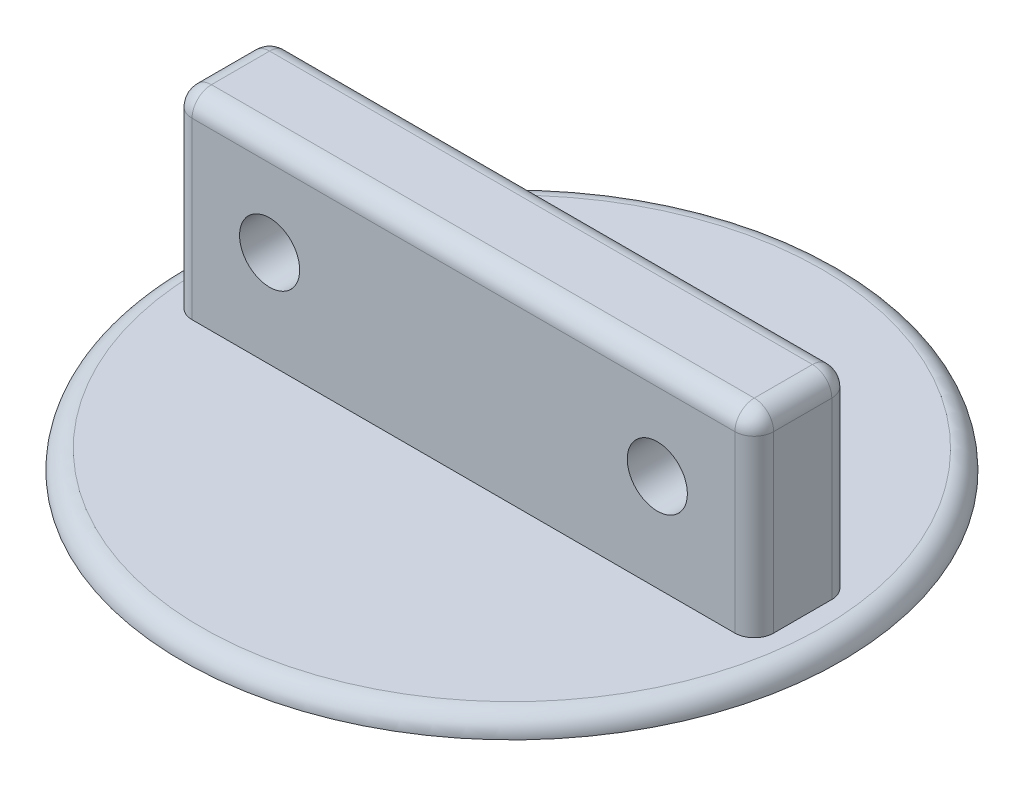
ISO-10303-21;
HEADER;
FILE_DESCRIPTION(('STEP AP214'),'2;1');
FILE_NAME('part.step','',(''),(''),'','','');
FILE_SCHEMA(('AUTOMOTIVE_DESIGN { 1 0 10303 214 1 1 1 1 }'));
ENDSEC;
DATA;
#1=APPLICATION_CONTEXT('core data for automotive mechanical design processes');
#2=APPLICATION_PROTOCOL_DEFINITION('international standard','automotive_design',2000,#1);
#3=PRODUCT_CONTEXT('',#1,'mechanical');
#4=PRODUCT('Part','Part','',(#3));
#5=PRODUCT_RELATED_PRODUCT_CATEGORY('part','',(#4));
#6=PRODUCT_DEFINITION_FORMATION('','',#4);
#7=PRODUCT_DEFINITION_CONTEXT('part definition',#1,'design');
#8=PRODUCT_DEFINITION('design','',#6,#7);
#9=PRODUCT_DEFINITION_SHAPE('','',#8);
#10=(LENGTH_UNIT() NAMED_UNIT(*) SI_UNIT(.MILLI.,.METRE.));
#11=(NAMED_UNIT(*) PLANE_ANGLE_UNIT() SI_UNIT($,.RADIAN.));
#12=(NAMED_UNIT(*) SI_UNIT($,.STERADIAN.) SOLID_ANGLE_UNIT());
#13=UNCERTAINTY_MEASURE_WITH_UNIT(LENGTH_MEASURE(1.E-05),#10,'distance_accuracy_value','');
#14=(GEOMETRIC_REPRESENTATION_CONTEXT(3) GLOBAL_UNCERTAINTY_ASSIGNED_CONTEXT((#13)) GLOBAL_UNIT_ASSIGNED_CONTEXT((#10,
#11,#12)) REPRESENTATION_CONTEXT('',''));
#15=CARTESIAN_POINT('',(0.,0.,0.));
#16=DIRECTION('',(0.,0.,1.));
#17=DIRECTION('',(1.,0.,0.));
#18=AXIS2_PLACEMENT_3D('',#15,#16,#17);
#19=CARTESIAN_POINT('',(38.1,12.7,6.35));
#20=DIRECTION('',(-1.,0.,0.));
#21=DIRECTION('',(0.,-1.,0.));
#22=AXIS2_PLACEMENT_3D('',#19,#20,#21);
#23=PLANE('',#22);
#24=DIRECTION('',(0.,0.,-1.));
#25=VECTOR('',#24,1.);
#26=CARTESIAN_POINT('',(38.1,10.16,6.35));
#27=LINE('',#26,#25);
#28=CARTESIAN_POINT('',(38.1,10.16,-3.81));
#29=VERTEX_POINT('',#28);
#30=CARTESIAN_POINT('',(38.1,10.16,3.81));
#31=VERTEX_POINT('',#30);
#32=EDGE_CURVE('E55',#29,#31,#27,.F.);
#33=ORIENTED_EDGE('',*,*,#32,.T.);
#34=DIRECTION('',(0.,1.,0.));
#35=VECTOR('',#34,1.);
#36=CARTESIAN_POINT('',(38.1,-12.7,3.81));
#37=LINE('',#36,#35);
#38=CARTESIAN_POINT('',(38.1,-12.7,3.81));
#39=VERTEX_POINT('',#38);
#40=EDGE_CURVE('E124',#31,#39,#37,.F.);
#41=ORIENTED_EDGE('',*,*,#40,.T.);
#42=DIRECTION('',(0.,0.,-1.));
#43=VECTOR('',#42,1.);
#44=CARTESIAN_POINT('',(38.1,-12.7,6.35));
#45=LINE('',#44,#43);
#46=CARTESIAN_POINT('',(38.1,-12.7,-3.81));
#47=VERTEX_POINT('',#46);
#48=EDGE_CURVE('E127',#39,#47,#45,.T.);
#49=ORIENTED_EDGE('',*,*,#48,.T.);
#50=DIRECTION('',(0.,1.,0.));
#51=VECTOR('',#50,1.);
#52=CARTESIAN_POINT('',(38.1,12.7,-3.81));
#53=LINE('',#52,#51);
#54=EDGE_CURVE('E60',#47,#29,#53,.T.);
#55=ORIENTED_EDGE('',*,*,#54,.T.);
#56=EDGE_LOOP('',(#33,#41,#49,#55));
#57=FACE_BOUND('',#56,.T.);
#58=ADVANCED_FACE('F39',(#57),#23,.F.);
#59=CARTESIAN_POINT('',(-38.1,12.7,6.35));
#60=DIRECTION('',(0.,-1.,0.));
#61=DIRECTION('',(0.,0.,-1.));
#62=AXIS2_PLACEMENT_3D('',#59,#60,#61);
#63=PLANE('',#62);
#64=DIRECTION('',(-1.,0.,0.));
#65=VECTOR('',#64,1.);
#66=CARTESIAN_POINT('',(-38.1,12.7,-3.81));
#67=LINE('',#66,#65);
#68=CARTESIAN_POINT('',(35.56,12.7,-3.81));
#69=VERTEX_POINT('',#68);
#70=CARTESIAN_POINT('',(-35.56,12.7,-3.81));
#71=VERTEX_POINT('',#70);
#72=EDGE_CURVE('E238',#69,#71,#67,.T.);
#73=ORIENTED_EDGE('',*,*,#72,.T.);
#74=DIRECTION('',(0.,0.,-1.));
#75=VECTOR('',#74,1.);
#76=CARTESIAN_POINT('',(-35.56,12.7,6.35));
#77=LINE('',#76,#75);
#78=CARTESIAN_POINT('',(-35.56,12.7,3.81));
#79=VERTEX_POINT('',#78);
#80=EDGE_CURVE('E241',#71,#79,#77,.F.);
#81=ORIENTED_EDGE('',*,*,#80,.T.);
#82=DIRECTION('',(-1.,0.,0.));
#83=VECTOR('',#82,1.);
#84=CARTESIAN_POINT('',(38.1,12.7,3.81));
#85=LINE('',#84,#83);
#86=CARTESIAN_POINT('',(35.56,12.7,3.81));
#87=VERTEX_POINT('',#86);
#88=EDGE_CURVE('E235',#79,#87,#85,.F.);
#89=ORIENTED_EDGE('',*,*,#88,.T.);
#90=DIRECTION('',(0.,0.,-1.));
#91=VECTOR('',#90,1.);
#92=CARTESIAN_POINT('',(35.56,12.7,6.35));
#93=LINE('',#92,#91);
#94=EDGE_CURVE('E232',#87,#69,#93,.T.);
#95=ORIENTED_EDGE('',*,*,#94,.T.);
#96=EDGE_LOOP('',(#73,#81,#89,#95));
#97=FACE_BOUND('',#96,.T.);
#98=ADVANCED_FACE('F328',(#97),#63,.F.);
#99=CARTESIAN_POINT('',(-38.1,12.7,6.35));
#100=DIRECTION('',(1.,0.,0.));
#101=DIRECTION('',(0.,0.,-1.));
#102=AXIS2_PLACEMENT_3D('',#99,#100,#101);
#103=PLANE('',#102);
#104=DIRECTION('',(0.,0.,-1.));
#105=VECTOR('',#104,1.);
#106=CARTESIAN_POINT('',(-38.1,-12.7,6.35));
#107=LINE('',#106,#105);
#108=CARTESIAN_POINT('',(-38.1,-12.7,3.81));
#109=VERTEX_POINT('',#108);
#110=CARTESIAN_POINT('',(-38.1,-12.7,-3.81));
#111=VERTEX_POINT('',#110);
#112=EDGE_CURVE('E132',#109,#111,#107,.T.);
#113=ORIENTED_EDGE('',*,*,#112,.F.);
#114=DIRECTION('',(0.,-1.,0.));
#115=VECTOR('',#114,1.);
#116=CARTESIAN_POINT('',(-38.1,12.7,3.81));
#117=LINE('',#116,#115);
#118=CARTESIAN_POINT('',(-38.1,10.16,3.81));
#119=VERTEX_POINT('',#118);
#120=EDGE_CURVE('E229',#109,#119,#117,.F.);
#121=ORIENTED_EDGE('',*,*,#120,.T.);
#122=DIRECTION('',(0.,0.,-1.));
#123=VECTOR('',#122,1.);
#124=CARTESIAN_POINT('',(-38.1,10.16,6.35));
#125=LINE('',#124,#123);
#126=CARTESIAN_POINT('',(-38.1,10.16,-3.81));
#127=VERTEX_POINT('',#126);
#128=EDGE_CURVE('E225',#119,#127,#125,.T.);
#129=ORIENTED_EDGE('',*,*,#128,.T.);
#130=DIRECTION('',(0.,-1.,0.));
#131=VECTOR('',#130,1.);
#132=CARTESIAN_POINT('',(-38.1,12.7,-3.81));
#133=LINE('',#132,#131);
#134=EDGE_CURVE('E222',#127,#111,#133,.T.);
#135=ORIENTED_EDGE('',*,*,#134,.T.);
#136=EDGE_LOOP('',(#113,#121,#129,#135));
#137=FACE_BOUND('',#136,.T.);
#138=ADVANCED_FACE('F309',(#137),#103,.F.);
#139=CARTESIAN_POINT('',(0.,0.,6.35));
#140=DIRECTION('',(0.,0.,1.));
#141=DIRECTION('',(1.,0.,0.));
#142=AXIS2_PLACEMENT_3D('',#139,#140,#141);
#143=PLANE('',#142);
#144=CARTESIAN_POINT('',(25.4,0.,6.35));
#145=DIRECTION('',(0.,0.,1.));
#146=DIRECTION('',(1.,0.,0.));
#147=AXIS2_PLACEMENT_3D('',#144,#145,#146);
#148=CIRCLE('',#147,3.937);
#149=CARTESIAN_POINT('',(29.337,0.,6.35));
#150=VERTEX_POINT('',#149);
#151=EDGE_CURVE('E196',#150,#150,#148,.T.);
#152=ORIENTED_EDGE('',*,*,#151,.F.);
#153=EDGE_LOOP('',(#152));
#154=FACE_BOUND('',#153,.T.);
#155=CARTESIAN_POINT('',(-25.4,0.,6.35));
#156=DIRECTION('',(0.,0.,1.));
#157=DIRECTION('',(1.,0.,0.));
#158=AXIS2_PLACEMENT_3D('',#155,#156,#157);
#159=CIRCLE('',#158,3.937);
#160=CARTESIAN_POINT('',(-21.463,0.,6.35));
#161=VERTEX_POINT('',#160);
#162=EDGE_CURVE('E195',#161,#161,#159,.T.);
#163=ORIENTED_EDGE('',*,*,#162,.F.);
#164=EDGE_LOOP('',(#163));
#165=FACE_BOUND('',#164,.T.);
#166=DIRECTION('',(1.,0.,0.));
#167=VECTOR('',#166,1.);
#168=CARTESIAN_POINT('',(-38.1,-12.7,6.35));
#169=LINE('',#168,#167);
#170=CARTESIAN_POINT('',(-35.56,-12.7,6.35));
#171=VERTEX_POINT('',#170);
#172=CARTESIAN_POINT('',(35.56,-12.7,6.35));
#173=VERTEX_POINT('',#172);
#174=EDGE_CURVE('E133',#171,#173,#169,.T.);
#175=ORIENTED_EDGE('',*,*,#174,.T.);
#176=DIRECTION('',(0.,1.,0.));
#177=VECTOR('',#176,1.);
#178=CARTESIAN_POINT('',(35.56,12.7,6.35));
#179=LINE('',#178,#177);
#180=CARTESIAN_POINT('',(35.56,10.16,6.35));
#181=VERTEX_POINT('',#180);
#182=EDGE_CURVE('E260',#173,#181,#179,.T.);
#183=ORIENTED_EDGE('',*,*,#182,.T.);
#184=DIRECTION('',(-1.,0.,0.));
#185=VECTOR('',#184,1.);
#186=CARTESIAN_POINT('',(-38.1,10.16,6.35));
#187=LINE('',#186,#185);
#188=CARTESIAN_POINT('',(-35.56,10.16,6.35));
#189=VERTEX_POINT('',#188);
#190=EDGE_CURVE('E254',#181,#189,#187,.T.);
#191=ORIENTED_EDGE('',*,*,#190,.T.);
#192=DIRECTION('',(0.,-1.,0.));
#193=VECTOR('',#192,1.);
#194=CARTESIAN_POINT('',(-35.56,-12.7,6.35));
#195=LINE('',#194,#193);
#196=EDGE_CURVE('E257',#189,#171,#195,.T.);
#197=ORIENTED_EDGE('',*,*,#196,.T.);
#198=EDGE_LOOP('',(#175,#183,#191,#197));
#199=FACE_BOUND('',#198,.T.);
#200=ADVANCED_FACE('F300',(#154,#165,#199),#143,.T.);
#201=CARTESIAN_POINT('',(0.,0.,-6.35));
#202=DIRECTION('',(0.,0.,1.));
#203=DIRECTION('',(1.,0.,0.));
#204=AXIS2_PLACEMENT_3D('',#201,#202,#203);
#205=PLANE('',#204);
#206=CARTESIAN_POINT('',(25.4,0.,-6.35));
#207=DIRECTION('',(0.,0.,1.));
#208=DIRECTION('',(1.,0.,0.));
#209=AXIS2_PLACEMENT_3D('',#206,#207,#208);
#210=CIRCLE('',#209,3.93699999999999);
#211=CARTESIAN_POINT('',(29.337,0.,-6.35));
#212=VERTEX_POINT('',#211);
#213=EDGE_CURVE('E192',#212,#212,#210,.T.);
#214=ORIENTED_EDGE('',*,*,#213,.T.);
#215=EDGE_LOOP('',(#214));
#216=FACE_BOUND('',#215,.T.);
#217=CARTESIAN_POINT('',(-25.4,0.,-6.35));
#218=DIRECTION('',(0.,0.,1.));
#219=DIRECTION('',(1.,0.,0.));
#220=AXIS2_PLACEMENT_3D('',#217,#218,#219);
#221=CIRCLE('',#220,3.93699999999999);
#222=CARTESIAN_POINT('',(-21.463,0.,-6.35));
#223=VERTEX_POINT('',#222);
#224=EDGE_CURVE('E153',#223,#223,#221,.T.);
#225=ORIENTED_EDGE('',*,*,#224,.T.);
#226=EDGE_LOOP('',(#225));
#227=FACE_BOUND('',#226,.T.);
#228=DIRECTION('',(-1.,0.,0.));
#229=VECTOR('',#228,1.);
#230=CARTESIAN_POINT('',(0.,10.16,-6.35));
#231=LINE('',#230,#229);
#232=CARTESIAN_POINT('',(-35.56,10.16,-6.35));
#233=VERTEX_POINT('',#232);
#234=CARTESIAN_POINT('',(35.56,10.16,-6.35));
#235=VERTEX_POINT('',#234);
#236=EDGE_CURVE('E248',#233,#235,#231,.F.);
#237=ORIENTED_EDGE('',*,*,#236,.T.);
#238=DIRECTION('',(0.,1.,0.));
#239=VECTOR('',#238,1.);
#240=CARTESIAN_POINT('',(35.56,0.,-6.35));
#241=LINE('',#240,#239);
#242=CARTESIAN_POINT('',(35.56,-12.7,-6.35));
#243=VERTEX_POINT('',#242);
#244=EDGE_CURVE('E251',#235,#243,#241,.F.);
#245=ORIENTED_EDGE('',*,*,#244,.T.);
#246=DIRECTION('',(1.,0.,0.));
#247=VECTOR('',#246,1.);
#248=CARTESIAN_POINT('',(-38.1,-12.7,-6.35));
#249=LINE('',#248,#247);
#250=CARTESIAN_POINT('',(-35.56,-12.7,-6.35));
#251=VERTEX_POINT('',#250);
#252=EDGE_CURVE('E137',#251,#243,#249,.T.);
#253=ORIENTED_EDGE('',*,*,#252,.F.);
#254=DIRECTION('',(0.,-1.,0.));
#255=VECTOR('',#254,1.);
#256=CARTESIAN_POINT('',(-35.56,0.,-6.35));
#257=LINE('',#256,#255);
#258=EDGE_CURVE('E245',#251,#233,#257,.F.);
#259=ORIENTED_EDGE('',*,*,#258,.T.);
#260=EDGE_LOOP('',(#237,#245,#253,#259));
#261=FACE_BOUND('',#260,.T.);
#262=ADVANCED_FACE('F275',(#216,#227,#261),#205,.F.);
#263=CARTESIAN_POINT('',(35.56,0.,3.81));
#264=DIRECTION('',(0.,-1.,0.));
#265=DIRECTION('',(1.,0.,0.));
#266=AXIS2_PLACEMENT_3D('',#263,#264,#265);
#267=CYLINDRICAL_SURFACE('',#266,2.54);
#268=CARTESIAN_POINT('',(35.56,-12.7,3.81));
#269=DIRECTION('',(0.,1.,0.));
#270=DIRECTION('',(0.,0.,1.));
#271=AXIS2_PLACEMENT_3D('',#268,#269,#270);
#272=CIRCLE('',#271,2.54);
#273=EDGE_CURVE('E48',#39,#173,#272,.F.);
#274=ORIENTED_EDGE('',*,*,#273,.F.);
#275=ORIENTED_EDGE('',*,*,#40,.F.);
#276=CARTESIAN_POINT('',(35.56,10.16,3.81));
#277=DIRECTION('',(0.,1.,0.));
#278=DIRECTION('',(0.,0.,1.));
#279=AXIS2_PLACEMENT_3D('',#276,#277,#278);
#280=CIRCLE('',#279,2.54);
#281=EDGE_CURVE('E185',#181,#31,#280,.T.);
#282=ORIENTED_EDGE('',*,*,#281,.F.);
#283=ORIENTED_EDGE('',*,*,#182,.F.);
#284=EDGE_LOOP('',(#274,#275,#282,#283));
#285=FACE_BOUND('',#284,.T.);
#286=ADVANCED_FACE('F296',(#285),#267,.T.);
#287=CARTESIAN_POINT('',(35.56,12.7,-3.81));
#288=DIRECTION('',(0.,1.,0.));
#289=DIRECTION('',(-1.,0.,0.));
#290=AXIS2_PLACEMENT_3D('',#287,#288,#289);
#291=CYLINDRICAL_SURFACE('',#290,2.54);
#292=CARTESIAN_POINT('',(35.56,-12.7,-3.81));
#293=DIRECTION('',(0.,1.,0.));
#294=DIRECTION('',(0.,0.,1.));
#295=AXIS2_PLACEMENT_3D('',#292,#293,#294);
#296=CIRCLE('',#295,2.54);
#297=EDGE_CURVE('E118',#243,#47,#296,.F.);
#298=ORIENTED_EDGE('',*,*,#297,.F.);
#299=ORIENTED_EDGE('',*,*,#244,.F.);
#300=CARTESIAN_POINT('',(35.56,10.16,-3.81));
#301=DIRECTION('',(0.,1.,0.));
#302=DIRECTION('',(0.,0.,1.));
#303=AXIS2_PLACEMENT_3D('',#300,#301,#302);
#304=CIRCLE('',#303,2.54);
#305=EDGE_CURVE('E121',#29,#235,#304,.T.);
#306=ORIENTED_EDGE('',*,*,#305,.F.);
#307=ORIENTED_EDGE('',*,*,#54,.F.);
#308=EDGE_LOOP('',(#298,#299,#306,#307));
#309=FACE_BOUND('',#308,.T.);
#310=ADVANCED_FACE('F115',(#309),#291,.T.);
#311=CARTESIAN_POINT('',(35.56,10.16,6.35));
#312=DIRECTION('',(0.,0.,-1.));
#313=DIRECTION('',(-1.,0.,0.));
#314=AXIS2_PLACEMENT_3D('',#311,#312,#313);
#315=CYLINDRICAL_SURFACE('',#314,2.54);
#316=CARTESIAN_POINT('',(35.56,10.16,3.81));
#317=DIRECTION('',(0.,0.,1.));
#318=DIRECTION('',(1.,0.,0.));
#319=AXIS2_PLACEMENT_3D('',#316,#317,#318);
#320=CIRCLE('',#319,2.54);
#321=EDGE_CURVE('E189',#31,#87,#320,.T.);
#322=ORIENTED_EDGE('',*,*,#321,.F.);
#323=ORIENTED_EDGE('',*,*,#32,.F.);
#324=CARTESIAN_POINT('',(35.56,10.16,-3.81));
#325=DIRECTION('',(0.,0.,-1.));
#326=DIRECTION('',(-1.,0.,0.));
#327=AXIS2_PLACEMENT_3D('',#324,#325,#326);
#328=CIRCLE('',#327,2.54);
#329=EDGE_CURVE('E180',#69,#29,#328,.T.);
#330=ORIENTED_EDGE('',*,*,#329,.F.);
#331=ORIENTED_EDGE('',*,*,#94,.F.);
#332=EDGE_LOOP('',(#322,#323,#330,#331));
#333=FACE_BOUND('',#332,.T.);
#334=ADVANCED_FACE('F288',(#333),#315,.T.);
#335=CARTESIAN_POINT('',(35.56,10.16,3.81));
#336=DIRECTION('',(1.,0.,0.));
#337=DIRECTION('',(0.,0.,-1.));
#338=AXIS2_PLACEMENT_3D('',#335,#336,#337);
#339=SPHERICAL_SURFACE('',#338,2.54);
#340=ORIENTED_EDGE('',*,*,#281,.T.);
#341=ORIENTED_EDGE('',*,*,#321,.T.);
#342=CARTESIAN_POINT('',(35.56,10.16,3.81));
#343=DIRECTION('',(1.,0.,0.));
#344=DIRECTION('',(0.,0.,-1.));
#345=AXIS2_PLACEMENT_3D('',#342,#343,#344);
#346=CIRCLE('',#345,2.54);
#347=EDGE_CURVE('E176',#181,#87,#346,.F.);
#348=ORIENTED_EDGE('',*,*,#347,.F.);
#349=EDGE_LOOP('',(#340,#341,#348));
#350=FACE_BOUND('',#349,.T.);
#351=ADVANCED_FACE('F292',(#350),#339,.T.);
#352=CARTESIAN_POINT('',(35.56,10.16,-3.81));
#353=DIRECTION('',(1.,0.,0.));
#354=DIRECTION('',(0.,0.,-1.));
#355=AXIS2_PLACEMENT_3D('',#352,#353,#354);
#356=SPHERICAL_SURFACE('',#355,2.54);
#357=ORIENTED_EDGE('',*,*,#329,.T.);
#358=ORIENTED_EDGE('',*,*,#305,.T.);
#359=CARTESIAN_POINT('',(35.56,10.16,-3.81));
#360=DIRECTION('',(1.,0.,0.));
#361=DIRECTION('',(0.,0.,-1.));
#362=AXIS2_PLACEMENT_3D('',#359,#360,#361);
#363=CIRCLE('',#362,2.54);
#364=EDGE_CURVE('E172',#69,#235,#363,.F.);
#365=ORIENTED_EDGE('',*,*,#364,.F.);
#366=EDGE_LOOP('',(#357,#358,#365));
#367=FACE_BOUND('',#366,.T.);
#368=ADVANCED_FACE('F283',(#367),#356,.T.);
#369=CARTESIAN_POINT('',(0.,10.16,3.81));
#370=DIRECTION('',(1.,0.,0.));
#371=DIRECTION('',(0.,0.,-1.));
#372=AXIS2_PLACEMENT_3D('',#369,#370,#371);
#373=CYLINDRICAL_SURFACE('',#372,2.54);
#374=ORIENTED_EDGE('',*,*,#347,.T.);
#375=ORIENTED_EDGE('',*,*,#88,.F.);
#376=CARTESIAN_POINT('',(-35.56,10.16,3.81));
#377=DIRECTION('',(-1.,0.,0.));
#378=DIRECTION('',(0.,0.,1.));
#379=AXIS2_PLACEMENT_3D('',#376,#377,#378);
#380=CIRCLE('',#379,2.54);
#381=EDGE_CURVE('E168',#189,#79,#380,.T.);
#382=ORIENTED_EDGE('',*,*,#381,.F.);
#383=ORIENTED_EDGE('',*,*,#190,.F.);
#384=EDGE_LOOP('',(#374,#375,#382,#383));
#385=FACE_BOUND('',#384,.T.);
#386=ADVANCED_FACE('F394',(#385),#373,.T.);
#387=CARTESIAN_POINT('',(-35.56,0.,3.81));
#388=DIRECTION('',(0.,1.,0.));
#389=DIRECTION('',(0.,0.,1.));
#390=AXIS2_PLACEMENT_3D('',#387,#388,#389);
#391=CYLINDRICAL_SURFACE('',#390,2.54);
#392=CARTESIAN_POINT('',(-35.56,-12.7,3.81));
#393=DIRECTION('',(0.,1.,0.));
#394=DIRECTION('',(0.,0.,1.));
#395=AXIS2_PLACEMENT_3D('',#392,#393,#394);
#396=CIRCLE('',#395,2.54);
#397=EDGE_CURVE('E139',#171,#109,#396,.F.);
#398=ORIENTED_EDGE('',*,*,#397,.F.);
#399=ORIENTED_EDGE('',*,*,#196,.F.);
#400=CARTESIAN_POINT('',(-35.56,10.16,3.81));
#401=DIRECTION('',(0.,1.,0.));
#402=DIRECTION('',(0.,0.,1.));
#403=AXIS2_PLACEMENT_3D('',#400,#401,#402);
#404=CIRCLE('',#403,2.54);
#405=EDGE_CURVE('E164',#119,#189,#404,.T.);
#406=ORIENTED_EDGE('',*,*,#405,.F.);
#407=ORIENTED_EDGE('',*,*,#120,.F.);
#408=EDGE_LOOP('',(#398,#399,#406,#407));
#409=FACE_BOUND('',#408,.T.);
#410=ADVANCED_FACE('F306',(#409),#391,.T.);
#411=CARTESIAN_POINT('',(-35.56,12.7,-3.81));
#412=DIRECTION('',(0.,-1.,0.));
#413=DIRECTION('',(0.,0.,-1.));
#414=AXIS2_PLACEMENT_3D('',#411,#412,#413);
#415=CYLINDRICAL_SURFACE('',#414,2.54);
#416=CARTESIAN_POINT('',(-35.56,-12.7,-3.81));
#417=DIRECTION('',(0.,1.,0.));
#418=DIRECTION('',(0.,0.,1.));
#419=AXIS2_PLACEMENT_3D('',#416,#417,#418);
#420=CIRCLE('',#419,2.54);
#421=EDGE_CURVE('E145',#111,#251,#420,.F.);
#422=ORIENTED_EDGE('',*,*,#421,.F.);
#423=ORIENTED_EDGE('',*,*,#134,.F.);
#424=CARTESIAN_POINT('',(-35.56,10.16,-3.81));
#425=DIRECTION('',(0.,1.,0.));
#426=DIRECTION('',(0.,0.,1.));
#427=AXIS2_PLACEMENT_3D('',#424,#425,#426);
#428=CIRCLE('',#427,2.54);
#429=EDGE_CURVE('E160',#233,#127,#428,.T.);
#430=ORIENTED_EDGE('',*,*,#429,.F.);
#431=ORIENTED_EDGE('',*,*,#258,.F.);
#432=EDGE_LOOP('',(#422,#423,#430,#431));
#433=FACE_BOUND('',#432,.T.);
#434=ADVANCED_FACE('F271',(#433),#415,.T.);
#435=CARTESIAN_POINT('',(-38.1,10.16,-3.81));
#436=DIRECTION('',(-1.,0.,0.));
#437=DIRECTION('',(0.,0.,1.));
#438=AXIS2_PLACEMENT_3D('',#435,#436,#437);
#439=CYLINDRICAL_SURFACE('',#438,2.54);
#440=ORIENTED_EDGE('',*,*,#364,.T.);
#441=ORIENTED_EDGE('',*,*,#236,.F.);
#442=CARTESIAN_POINT('',(-35.56,10.16,-3.81));
#443=DIRECTION('',(-1.,0.,0.));
#444=DIRECTION('',(0.,0.,1.));
#445=AXIS2_PLACEMENT_3D('',#442,#443,#444);
#446=CIRCLE('',#445,2.54);
#447=EDGE_CURVE('E156',#71,#233,#446,.T.);
#448=ORIENTED_EDGE('',*,*,#447,.F.);
#449=ORIENTED_EDGE('',*,*,#72,.F.);
#450=EDGE_LOOP('',(#440,#441,#448,#449));
#451=FACE_BOUND('',#450,.T.);
#452=ADVANCED_FACE('F278',(#451),#439,.T.);
#453=CARTESIAN_POINT('',(-35.56,10.16,3.81));
#454=DIRECTION('',(0.,0.,1.));
#455=DIRECTION('',(1.,0.,0.));
#456=AXIS2_PLACEMENT_3D('',#453,#454,#455);
#457=SPHERICAL_SURFACE('',#456,2.54);
#458=ORIENTED_EDGE('',*,*,#405,.T.);
#459=ORIENTED_EDGE('',*,*,#381,.T.);
#460=CARTESIAN_POINT('',(-35.56,10.16,3.81));
#461=DIRECTION('',(0.,0.,1.));
#462=DIRECTION('',(1.,0.,0.));
#463=AXIS2_PLACEMENT_3D('',#460,#461,#462);
#464=CIRCLE('',#463,2.54);
#465=EDGE_CURVE('E152',#119,#79,#464,.F.);
#466=ORIENTED_EDGE('',*,*,#465,.F.);
#467=EDGE_LOOP('',(#458,#459,#466));
#468=FACE_BOUND('',#467,.T.);
#469=ADVANCED_FACE('F317',(#468),#457,.T.);
#470=CARTESIAN_POINT('',(-35.56,10.16,-3.81));
#471=DIRECTION('',(0.,0.,-1.));
#472=DIRECTION('',(-1.,0.,0.));
#473=AXIS2_PLACEMENT_3D('',#470,#471,#472);
#474=SPHERICAL_SURFACE('',#473,2.54);
#475=ORIENTED_EDGE('',*,*,#447,.T.);
#476=ORIENTED_EDGE('',*,*,#429,.T.);
#477=CARTESIAN_POINT('',(-35.56,10.16,-3.81));
#478=DIRECTION('',(0.,0.,-1.));
#479=DIRECTION('',(-1.,0.,0.));
#480=AXIS2_PLACEMENT_3D('',#477,#478,#479);
#481=CIRCLE('',#480,2.54);
#482=EDGE_CURVE('E149',#71,#127,#481,.F.);
#483=ORIENTED_EDGE('',*,*,#482,.F.);
#484=EDGE_LOOP('',(#475,#476,#483));
#485=FACE_BOUND('',#484,.T.);
#486=ADVANCED_FACE('F315',(#485),#474,.T.);
#487=CARTESIAN_POINT('',(-35.56,10.16,6.35));
#488=DIRECTION('',(0.,0.,-1.));
#489=DIRECTION('',(-1.,0.,0.));
#490=AXIS2_PLACEMENT_3D('',#487,#488,#489);
#491=CYLINDRICAL_SURFACE('',#490,2.54);
#492=ORIENTED_EDGE('',*,*,#465,.T.);
#493=ORIENTED_EDGE('',*,*,#80,.F.);
#494=ORIENTED_EDGE('',*,*,#482,.T.);
#495=ORIENTED_EDGE('',*,*,#128,.F.);
#496=EDGE_LOOP('',(#492,#493,#494,#495));
#497=FACE_BOUND('',#496,.T.);
#498=ADVANCED_FACE('F312',(#497),#491,.T.);
#499=CARTESIAN_POINT('',(-25.4,0.,6.35));
#500=DIRECTION('',(0.,0.,1.));
#501=DIRECTION('',(1.,0.,0.));
#502=AXIS2_PLACEMENT_3D('',#499,#500,#501);
#503=CYLINDRICAL_SURFACE('',#502,3.93699999999999);
#504=ORIENTED_EDGE('',*,*,#162,.T.);
#505=EDGE_LOOP('',(#504));
#506=FACE_BOUND('',#505,.T.);
#507=ORIENTED_EDGE('',*,*,#224,.F.);
#508=EDGE_LOOP('',(#507));
#509=FACE_BOUND('',#508,.T.);
#510=ADVANCED_FACE('F323',(#506,#509),#503,.F.);
#511=CARTESIAN_POINT('',(25.4,0.,6.35));
#512=DIRECTION('',(0.,0.,1.));
#513=DIRECTION('',(1.,0.,0.));
#514=AXIS2_PLACEMENT_3D('',#511,#512,#513);
#515=CYLINDRICAL_SURFACE('',#514,3.93699999999999);
#516=ORIENTED_EDGE('',*,*,#151,.T.);
#517=EDGE_LOOP('',(#516));
#518=FACE_BOUND('',#517,.T.);
#519=ORIENTED_EDGE('',*,*,#213,.F.);
#520=EDGE_LOOP('',(#519));
#521=FACE_BOUND('',#520,.T.);
#522=ADVANCED_FACE('F345',(#518,#521),#515,.F.);
#523=CARTESIAN_POINT('',(0.,-12.7,0.));
#524=DIRECTION('',(0.,-1.,0.));
#525=DIRECTION('',(0.,0.,-1.));
#526=AXIS2_PLACEMENT_3D('',#523,#524,#525);
#527=PLANE('',#526);
#528=CARTESIAN_POINT('',(0.,-12.7,0.));
#529=DIRECTION('',(0.,-1.,0.));
#530=DIRECTION('',(0.,0.,-1.));
#531=AXIS2_PLACEMENT_3D('',#528,#529,#530);
#532=CIRCLE('',#531,40.64);
#533=CARTESIAN_POINT('',(0.,-12.7,-40.64));
#534=VERTEX_POINT('',#533);
#535=EDGE_CURVE('E11',#534,#534,#532,.F.);
#536=ORIENTED_EDGE('',*,*,#535,.T.);
#537=EDGE_LOOP('',(#536));
#538=FACE_BOUND('',#537,.T.);
#539=ORIENTED_EDGE('',*,*,#48,.F.);
#540=ORIENTED_EDGE('',*,*,#273,.T.);
#541=ORIENTED_EDGE('',*,*,#174,.F.);
#542=ORIENTED_EDGE('',*,*,#397,.T.);
#543=ORIENTED_EDGE('',*,*,#112,.T.);
#544=ORIENTED_EDGE('',*,*,#421,.T.);
#545=ORIENTED_EDGE('',*,*,#252,.T.);
#546=ORIENTED_EDGE('',*,*,#297,.T.);
#547=EDGE_LOOP('',(#539,#540,#541,#542,#543,#544,#545,#546));
#548=FACE_BOUND('',#547,.T.);
#549=ADVANCED_FACE('F135',(#538,#548),#527,.F.);
#550=CARTESIAN_POINT('',(0.,-15.24,0.));
#551=DIRECTION('',(0.,-1.,0.));
#552=DIRECTION('',(0.,0.,-1.));
#553=AXIS2_PLACEMENT_3D('',#550,#551,#552);
#554=PLANE('',#553);
#555=CARTESIAN_POINT('',(0.,-15.24,0.));
#556=DIRECTION('',(0.,-1.,0.));
#557=DIRECTION('',(0.,0.,-1.));
#558=AXIS2_PLACEMENT_3D('',#555,#556,#557);
#559=CIRCLE('',#558,43.18);
#560=CARTESIAN_POINT('',(0.,-15.24,-43.18));
#561=VERTEX_POINT('',#560);
#562=EDGE_CURVE('E204',#561,#561,#559,.T.);
#563=ORIENTED_EDGE('',*,*,#562,.T.);
#564=EDGE_LOOP('',(#563));
#565=FACE_BOUND('',#564,.T.);
#566=ADVANCED_FACE('F351',(#565),#554,.T.);
#567=CARTESIAN_POINT('',(0.,-15.24,0.));
#568=DIRECTION('',(0.,-1.,0.));
#569=DIRECTION('',(0.,0.,-1.));
#570=AXIS2_PLACEMENT_3D('',#567,#568,#569);
#571=TOROIDAL_SURFACE('',#570,40.64,2.54);
#572=ORIENTED_EDGE('',*,*,#535,.F.);
#573=EDGE_LOOP('',(#572));
#574=FACE_BOUND('',#573,.T.);
#575=ORIENTED_EDGE('',*,*,#562,.F.);
#576=EDGE_LOOP('',(#575));
#577=FACE_BOUND('',#576,.T.);
#578=ADVANCED_FACE('F41',(#574,#577),#571,.T.);
#579=CLOSED_SHELL('',(#58,#98,#138,#200,#262,#286,#310,#334,#351,#368,#386,#410,#434,#452,#469,
#486,#498,#510,#522,#549,#566,#578));
#580=MANIFOLD_SOLID_BREP('B2',#579);
#581=ADVANCED_BREP_SHAPE_REPRESENTATION('',(#18,#580),#14);
#582=SHAPE_DEFINITION_REPRESENTATION(#9,#581);
ENDSEC;
END-ISO-10303-21;
